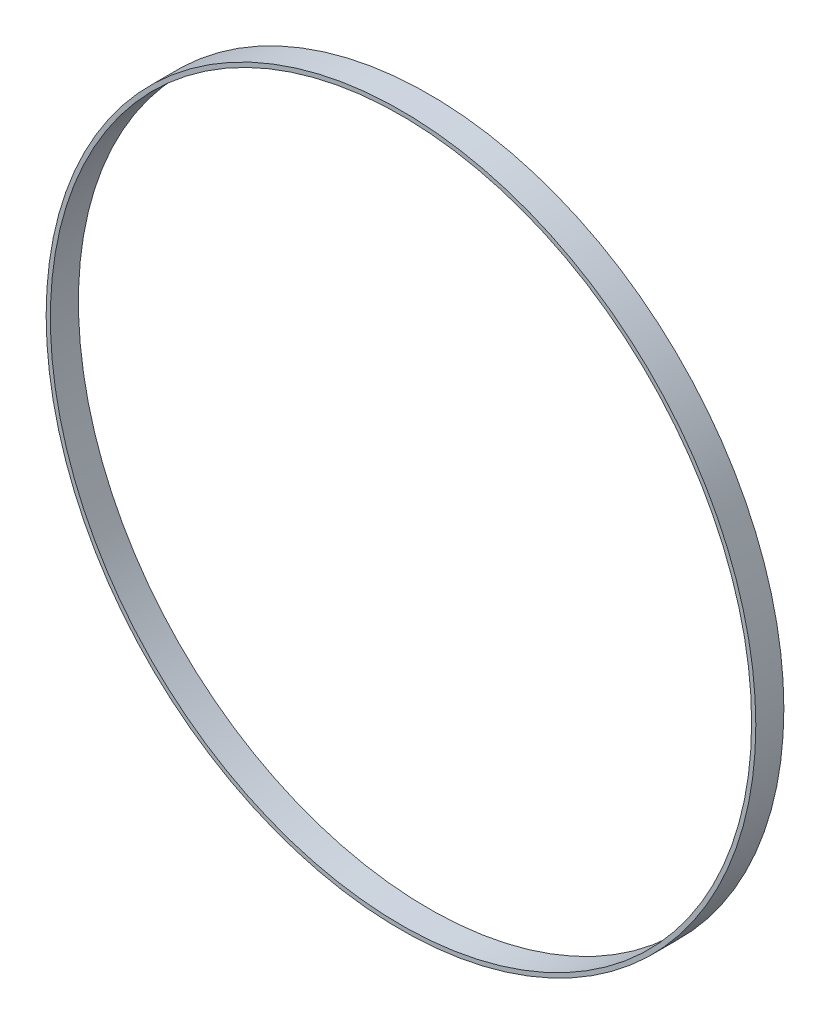
ISO-10303-21;
HEADER;
FILE_DESCRIPTION(('STEP AP214'),'2;1');
FILE_NAME('part.step','',(''),(''),'','','');
FILE_SCHEMA(('AUTOMOTIVE_DESIGN { 1 0 10303 214 1 1 1 1 }'));
ENDSEC;
DATA;
#1=APPLICATION_CONTEXT('core data for automotive mechanical design processes');
#2=APPLICATION_PROTOCOL_DEFINITION('international standard','automotive_design',2000,#1);
#3=PRODUCT_CONTEXT('',#1,'mechanical');
#4=PRODUCT('Part','Part','',(#3));
#5=PRODUCT_RELATED_PRODUCT_CATEGORY('part','',(#4));
#6=PRODUCT_DEFINITION_FORMATION('','',#4);
#7=PRODUCT_DEFINITION_CONTEXT('part definition',#1,'design');
#8=PRODUCT_DEFINITION('design','',#6,#7);
#9=PRODUCT_DEFINITION_SHAPE('','',#8);
#10=(LENGTH_UNIT() NAMED_UNIT(*) SI_UNIT(.MILLI.,.METRE.));
#11=(NAMED_UNIT(*) PLANE_ANGLE_UNIT() SI_UNIT($,.RADIAN.));
#12=(NAMED_UNIT(*) SI_UNIT($,.STERADIAN.) SOLID_ANGLE_UNIT());
#13=UNCERTAINTY_MEASURE_WITH_UNIT(LENGTH_MEASURE(1.E-05),#10,'distance_accuracy_value','');
#14=(GEOMETRIC_REPRESENTATION_CONTEXT(3) GLOBAL_UNCERTAINTY_ASSIGNED_CONTEXT((#13)) GLOBAL_UNIT_ASSIGNED_CONTEXT((#10,
#11,#12)) REPRESENTATION_CONTEXT('',''));
#15=CARTESIAN_POINT('',(0.,0.,0.));
#16=DIRECTION('',(0.,0.,1.));
#17=DIRECTION('',(1.,0.,0.));
#18=AXIS2_PLACEMENT_3D('',#15,#16,#17);
#19=CARTESIAN_POINT('',(0.,0.,20.));
#20=DIRECTION('',(0.,0.,1.));
#21=DIRECTION('',(1.,0.,0.));
#22=AXIS2_PLACEMENT_3D('',#19,#20,#21);
#23=PLANE('',#22);
#24=CARTESIAN_POINT('',(0.,0.,20.));
#25=DIRECTION('',(0.,0.,1.));
#26=DIRECTION('',(1.,0.,0.));
#27=AXIS2_PLACEMENT_3D('',#24,#25,#26);
#28=CIRCLE('',#27,253.);
#29=CARTESIAN_POINT('',(253.,0.,20.));
#30=VERTEX_POINT('',#29);
#31=EDGE_CURVE('E10',#30,#30,#28,.T.);
#32=ORIENTED_EDGE('',*,*,#31,.T.);
#33=EDGE_LOOP('',(#32));
#34=FACE_BOUND('',#33,.T.);
#35=CARTESIAN_POINT('',(0.,0.,20.));
#36=DIRECTION('',(0.,0.,1.));
#37=DIRECTION('',(1.,0.,0.));
#38=AXIS2_PLACEMENT_3D('',#35,#36,#37);
#39=CIRCLE('',#38,250.);
#40=CARTESIAN_POINT('',(250.,0.,20.));
#41=VERTEX_POINT('',#40);
#42=EDGE_CURVE('E42',#41,#41,#39,.T.);
#43=ORIENTED_EDGE('',*,*,#42,.F.);
#44=EDGE_LOOP('',(#43));
#45=FACE_BOUND('',#44,.T.);
#46=ADVANCED_FACE('F31',(#34,#45),#23,.T.);
#47=CARTESIAN_POINT('',(0.,0.,0.));
#48=DIRECTION('',(0.,0.,1.));
#49=DIRECTION('',(1.,0.,0.));
#50=AXIS2_PLACEMENT_3D('',#47,#48,#49);
#51=PLANE('',#50);
#52=CARTESIAN_POINT('',(0.,0.,0.));
#53=DIRECTION('',(0.,0.,1.));
#54=DIRECTION('',(1.,0.,0.));
#55=AXIS2_PLACEMENT_3D('',#52,#53,#54);
#56=CIRCLE('',#55,253.);
#57=CARTESIAN_POINT('',(253.,0.,0.));
#58=VERTEX_POINT('',#57);
#59=EDGE_CURVE('E35',#58,#58,#56,.T.);
#60=ORIENTED_EDGE('',*,*,#59,.F.);
#61=EDGE_LOOP('',(#60));
#62=FACE_BOUND('',#61,.T.);
#63=CARTESIAN_POINT('',(0.,0.,0.));
#64=DIRECTION('',(0.,0.,1.));
#65=DIRECTION('',(1.,0.,0.));
#66=AXIS2_PLACEMENT_3D('',#63,#64,#65);
#67=CIRCLE('',#66,250.);
#68=CARTESIAN_POINT('',(250.,0.,0.));
#69=VERTEX_POINT('',#68);
#70=EDGE_CURVE('E44',#69,#69,#67,.T.);
#71=ORIENTED_EDGE('',*,*,#70,.T.);
#72=EDGE_LOOP('',(#71));
#73=FACE_BOUND('',#72,.T.);
#74=ADVANCED_FACE('F54',(#62,#73),#51,.F.);
#75=CARTESIAN_POINT('',(0.,0.,20.));
#76=DIRECTION('',(0.,0.,-1.));
#77=DIRECTION('',(-1.,0.,0.));
#78=AXIS2_PLACEMENT_3D('',#75,#76,#77);
#79=CYLINDRICAL_SURFACE('',#78,253.);
#80=ORIENTED_EDGE('',*,*,#31,.F.);
#81=EDGE_LOOP('',(#80));
#82=FACE_BOUND('',#81,.T.);
#83=ORIENTED_EDGE('',*,*,#59,.T.);
#84=EDGE_LOOP('',(#83));
#85=FACE_BOUND('',#84,.T.);
#86=ADVANCED_FACE('F33',(#82,#85),#79,.T.);
#87=CARTESIAN_POINT('',(0.,0.,20.));
#88=DIRECTION('',(0.,0.,-1.));
#89=DIRECTION('',(-1.,0.,0.));
#90=AXIS2_PLACEMENT_3D('',#87,#88,#89);
#91=CYLINDRICAL_SURFACE('',#90,250.);
#92=ORIENTED_EDGE('',*,*,#42,.T.);
#93=EDGE_LOOP('',(#92));
#94=FACE_BOUND('',#93,.T.);
#95=ORIENTED_EDGE('',*,*,#70,.F.);
#96=EDGE_LOOP('',(#95));
#97=FACE_BOUND('',#96,.T.);
#98=ADVANCED_FACE('F50',(#94,#97),#91,.F.);
#99=CLOSED_SHELL('',(#46,#74,#86,#98));
#100=MANIFOLD_SOLID_BREP('B2',#99);
#101=ADVANCED_BREP_SHAPE_REPRESENTATION('',(#18,#100),#14);
#102=SHAPE_DEFINITION_REPRESENTATION(#9,#101);
ENDSEC;
END-ISO-10303-21;
